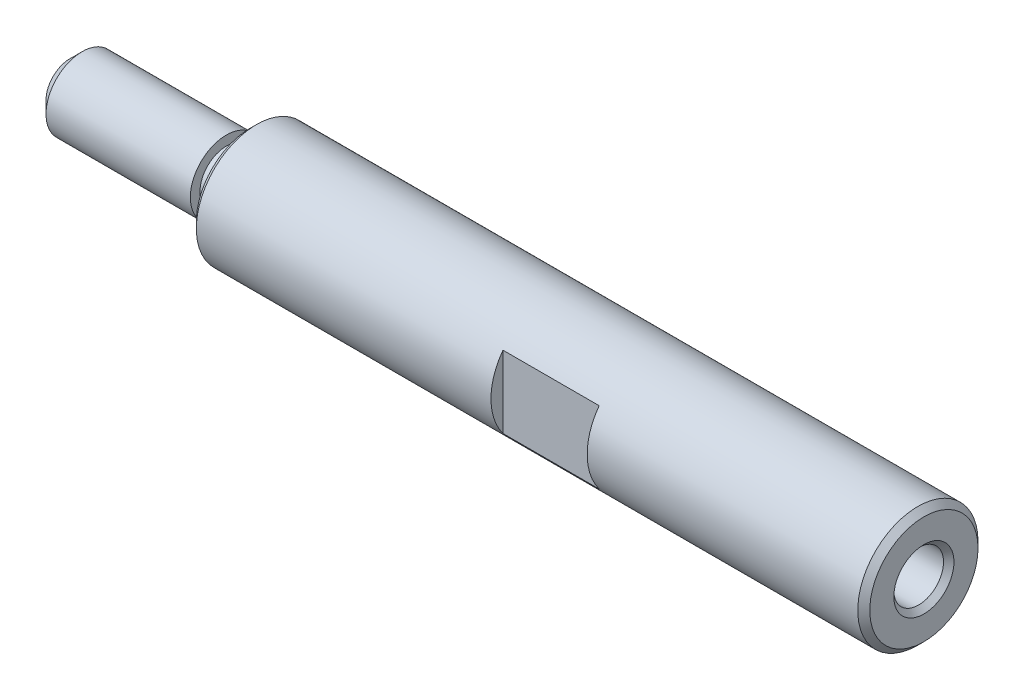
ISO-10303-21;
HEADER;
FILE_DESCRIPTION(('STEP AP214'),'2;1');
FILE_NAME('part.step','',(''),(''),'','','');
FILE_SCHEMA(('AUTOMOTIVE_DESIGN { 1 0 10303 214 1 1 1 1 }'));
ENDSEC;
DATA;
#1=APPLICATION_CONTEXT('core data for automotive mechanical design processes');
#2=APPLICATION_PROTOCOL_DEFINITION('international standard','automotive_design',2000,#1);
#3=PRODUCT_CONTEXT('',#1,'mechanical');
#4=PRODUCT('Part','Part','',(#3));
#5=PRODUCT_RELATED_PRODUCT_CATEGORY('part','',(#4));
#6=PRODUCT_DEFINITION_FORMATION('','',#4);
#7=PRODUCT_DEFINITION_CONTEXT('part definition',#1,'design');
#8=PRODUCT_DEFINITION('design','',#6,#7);
#9=PRODUCT_DEFINITION_SHAPE('','',#8);
#10=(LENGTH_UNIT() NAMED_UNIT(*) SI_UNIT(.MILLI.,.METRE.));
#11=(NAMED_UNIT(*) PLANE_ANGLE_UNIT() SI_UNIT($,.RADIAN.));
#12=(NAMED_UNIT(*) SI_UNIT($,.STERADIAN.) SOLID_ANGLE_UNIT());
#13=UNCERTAINTY_MEASURE_WITH_UNIT(LENGTH_MEASURE(1.E-05),#10,'distance_accuracy_value','');
#14=(GEOMETRIC_REPRESENTATION_CONTEXT(3) GLOBAL_UNCERTAINTY_ASSIGNED_CONTEXT((#13)) GLOBAL_UNIT_ASSIGNED_CONTEXT((#10,
#11,#12)) REPRESENTATION_CONTEXT('',''));
#15=CARTESIAN_POINT('',(0.,0.,0.));
#16=DIRECTION('',(0.,0.,1.));
#17=DIRECTION('',(1.,0.,0.));
#18=AXIS2_PLACEMENT_3D('',#15,#16,#17);
#19=CARTESIAN_POINT('',(-15.,0.,0.));
#20=DIRECTION('',(1.,0.,0.));
#21=DIRECTION('',(0.,0.,-1.));
#22=AXIS2_PLACEMENT_3D('',#19,#20,#21);
#23=PLANE('',#22);
#24=CARTESIAN_POINT('',(-15.,0.,0.));
#25=DIRECTION('',(1.,0.,0.));
#26=DIRECTION('',(0.,0.,-1.));
#27=AXIS2_PLACEMENT_3D('',#24,#25,#26);
#28=CIRCLE('',#27,2.);
#29=CARTESIAN_POINT('',(-15.,0.,-2.));
#30=VERTEX_POINT('',#29);
#31=EDGE_CURVE('E82',#30,#30,#28,.T.);
#32=ORIENTED_EDGE('',*,*,#31,.F.);
#33=EDGE_LOOP('',(#32));
#34=FACE_BOUND('',#33,.T.);
#35=ADVANCED_FACE('F16',(#34),#23,.F.);
#36=CARTESIAN_POINT('',(-15.,0.,0.));
#37=DIRECTION('',(1.,0.,0.));
#38=DIRECTION('',(0.,0.,-1.));
#39=AXIS2_PLACEMENT_3D('',#36,#37,#38);
#40=CONICAL_SURFACE('',#39,2.,0.785398163397448);
#41=CARTESIAN_POINT('',(-14.,0.,0.));
#42=DIRECTION('',(1.,0.,0.));
#43=DIRECTION('',(0.,0.,-1.));
#44=AXIS2_PLACEMENT_3D('',#41,#42,#43);
#45=CIRCLE('',#44,3.);
#46=CARTESIAN_POINT('',(-14.,0.,-3.));
#47=VERTEX_POINT('',#46);
#48=EDGE_CURVE('E85',#47,#47,#45,.T.);
#49=ORIENTED_EDGE('',*,*,#48,.F.);
#50=EDGE_LOOP('',(#49));
#51=FACE_BOUND('',#50,.T.);
#52=ORIENTED_EDGE('',*,*,#31,.T.);
#53=EDGE_LOOP('',(#52));
#54=FACE_BOUND('',#53,.T.);
#55=ADVANCED_FACE('F141',(#51,#54),#40,.T.);
#56=CARTESIAN_POINT('',(56.,0.,0.));
#57=DIRECTION('',(1.,0.,0.));
#58=DIRECTION('',(0.,0.,-1.));
#59=AXIS2_PLACEMENT_3D('',#56,#57,#58);
#60=CYLINDRICAL_SURFACE('',#59,3.);
#61=CARTESIAN_POINT('',(-2.,0.,0.));
#62=DIRECTION('',(1.,0.,0.));
#63=DIRECTION('',(0.,0.,-1.));
#64=AXIS2_PLACEMENT_3D('',#61,#62,#63);
#65=CIRCLE('',#64,3.);
#66=CARTESIAN_POINT('',(-2.,0.,-3.));
#67=VERTEX_POINT('',#66);
#68=EDGE_CURVE('E88',#67,#67,#65,.T.);
#69=ORIENTED_EDGE('',*,*,#68,.F.);
#70=EDGE_LOOP('',(#69));
#71=FACE_BOUND('',#70,.T.);
#72=ORIENTED_EDGE('',*,*,#48,.T.);
#73=EDGE_LOOP('',(#72));
#74=FACE_BOUND('',#73,.T.);
#75=ADVANCED_FACE('F146',(#71,#74),#60,.T.);
#76=CARTESIAN_POINT('',(-2.,3.,0.));
#77=DIRECTION('',(-1.,0.,0.));
#78=DIRECTION('',(0.,0.,1.));
#79=AXIS2_PLACEMENT_3D('',#76,#77,#78);
#80=PLANE('',#79);
#81=CARTESIAN_POINT('',(-2.,0.,0.));
#82=DIRECTION('',(1.,0.,0.));
#83=DIRECTION('',(0.,0.,-1.));
#84=AXIS2_PLACEMENT_3D('',#81,#82,#83);
#85=CIRCLE('',#84,2.2);
#86=CARTESIAN_POINT('',(-2.,0.,-2.2));
#87=VERTEX_POINT('',#86);
#88=EDGE_CURVE('E91',#87,#87,#85,.T.);
#89=ORIENTED_EDGE('',*,*,#88,.F.);
#90=EDGE_LOOP('',(#89));
#91=FACE_BOUND('',#90,.T.);
#92=ORIENTED_EDGE('',*,*,#68,.T.);
#93=EDGE_LOOP('',(#92));
#94=FACE_BOUND('',#93,.T.);
#95=ADVANCED_FACE('F153',(#91,#94),#80,.F.);
#96=CARTESIAN_POINT('',(56.,0.,0.));
#97=DIRECTION('',(1.,0.,0.));
#98=DIRECTION('',(0.,0.,-1.));
#99=AXIS2_PLACEMENT_3D('',#96,#97,#98);
#100=CYLINDRICAL_SURFACE('',#99,2.2);
#101=CARTESIAN_POINT('',(0.,0.,0.));
#102=DIRECTION('',(1.,0.,0.));
#103=DIRECTION('',(0.,0.,-1.));
#104=AXIS2_PLACEMENT_3D('',#101,#102,#103);
#105=CIRCLE('',#104,2.2);
#106=CARTESIAN_POINT('',(0.,0.,-2.2));
#107=VERTEX_POINT('',#106);
#108=EDGE_CURVE('E94',#107,#107,#105,.T.);
#109=ORIENTED_EDGE('',*,*,#108,.F.);
#110=EDGE_LOOP('',(#109));
#111=FACE_BOUND('',#110,.T.);
#112=ORIENTED_EDGE('',*,*,#88,.T.);
#113=EDGE_LOOP('',(#112));
#114=FACE_BOUND('',#113,.T.);
#115=ADVANCED_FACE('F160',(#111,#114),#100,.T.);
#116=CARTESIAN_POINT('',(0.,2.2,0.));
#117=DIRECTION('',(1.,0.,0.));
#118=DIRECTION('',(0.,0.,-1.));
#119=AXIS2_PLACEMENT_3D('',#116,#117,#118);
#120=PLANE('',#119);
#121=CARTESIAN_POINT('',(0.,0.,0.));
#122=DIRECTION('',(1.,0.,0.));
#123=DIRECTION('',(0.,0.,-1.));
#124=AXIS2_PLACEMENT_3D('',#121,#122,#123);
#125=CIRCLE('',#124,4.5);
#126=CARTESIAN_POINT('',(0.,0.,-4.5));
#127=VERTEX_POINT('',#126);
#128=EDGE_CURVE('E97',#127,#127,#125,.T.);
#129=ORIENTED_EDGE('',*,*,#128,.F.);
#130=EDGE_LOOP('',(#129));
#131=FACE_BOUND('',#130,.T.);
#132=ORIENTED_EDGE('',*,*,#108,.T.);
#133=EDGE_LOOP('',(#132));
#134=FACE_BOUND('',#133,.T.);
#135=ADVANCED_FACE('F164',(#131,#134),#120,.F.);
#136=CARTESIAN_POINT('',(0.,0.,0.));
#137=DIRECTION('',(1.,0.,0.));
#138=DIRECTION('',(0.,0.,-1.));
#139=AXIS2_PLACEMENT_3D('',#136,#137,#138);
#140=CONICAL_SURFACE('',#139,4.5,0.785398163397447);
#141=CARTESIAN_POINT('',(0.500000000000007,0.,0.));
#142=DIRECTION('',(1.,0.,0.));
#143=DIRECTION('',(0.,0.,-1.));
#144=AXIS2_PLACEMENT_3D('',#141,#142,#143);
#145=CIRCLE('',#144,5.);
#146=CARTESIAN_POINT('',(0.500000000000007,0.,-5.));
#147=VERTEX_POINT('',#146);
#148=EDGE_CURVE('E100',#147,#147,#145,.T.);
#149=ORIENTED_EDGE('',*,*,#148,.F.);
#150=EDGE_LOOP('',(#149));
#151=FACE_BOUND('',#150,.T.);
#152=ORIENTED_EDGE('',*,*,#128,.T.);
#153=EDGE_LOOP('',(#152));
#154=FACE_BOUND('',#153,.T.);
#155=ADVANCED_FACE('F168',(#151,#154),#140,.T.);
#156=CARTESIAN_POINT('',(56.,0.,0.));
#157=DIRECTION('',(1.,0.,0.));
#158=DIRECTION('',(0.,0.,-1.));
#159=AXIS2_PLACEMENT_3D('',#156,#157,#158);
#160=CYLINDRICAL_SURFACE('',#159,5.);
#161=CARTESIAN_POINT('',(55.5,0.,0.));
#162=DIRECTION('',(1.,0.,0.));
#163=DIRECTION('',(0.,0.,-1.));
#164=AXIS2_PLACEMENT_3D('',#161,#162,#163);
#165=CIRCLE('',#164,5.);
#166=CARTESIAN_POINT('',(55.5,0.,-5.));
#167=VERTEX_POINT('',#166);
#168=EDGE_CURVE('E103',#167,#167,#165,.T.);
#169=ORIENTED_EDGE('',*,*,#168,.F.);
#170=EDGE_LOOP('',(#169));
#171=FACE_BOUND('',#170,.T.);
#172=DIRECTION('',(1.,0.,0.));
#173=VECTOR('',#172,1.);
#174=CARTESIAN_POINT('',(56.,3.,4.));
#175=LINE('',#174,#173);
#176=CARTESIAN_POINT('',(25.,3.,4.));
#177=VERTEX_POINT('',#176);
#178=CARTESIAN_POINT('',(33.,3.,4.));
#179=VERTEX_POINT('',#178);
#180=EDGE_CURVE('E19',#177,#179,#175,.T.);
#181=ORIENTED_EDGE('',*,*,#180,.T.);
#182=CARTESIAN_POINT('',(33.,0.,0.));
#183=DIRECTION('',(1.,0.,0.));
#184=DIRECTION('',(0.,0.,-1.));
#185=AXIS2_PLACEMENT_3D('',#182,#183,#184);
#186=CIRCLE('',#185,5.);
#187=CARTESIAN_POINT('',(33.,-3.,4.));
#188=VERTEX_POINT('',#187);
#189=EDGE_CURVE('E11',#179,#188,#186,.T.);
#190=ORIENTED_EDGE('',*,*,#189,.T.);
#191=DIRECTION('',(1.,0.,0.));
#192=VECTOR('',#191,1.);
#193=CARTESIAN_POINT('',(56.,-3.,4.));
#194=LINE('',#193,#192);
#195=CARTESIAN_POINT('',(25.,-3.,4.));
#196=VERTEX_POINT('',#195);
#197=EDGE_CURVE('E64',#188,#196,#194,.F.);
#198=ORIENTED_EDGE('',*,*,#197,.T.);
#199=CARTESIAN_POINT('',(25.,0.,0.));
#200=DIRECTION('',(1.,0.,0.));
#201=DIRECTION('',(0.,0.,-1.));
#202=AXIS2_PLACEMENT_3D('',#199,#200,#201);
#203=CIRCLE('',#202,5.);
#204=EDGE_CURVE('E59',#177,#196,#203,.T.);
#205=ORIENTED_EDGE('',*,*,#204,.F.);
#206=EDGE_LOOP('',(#181,#190,#198,#205));
#207=FACE_BOUND('',#206,.T.);
#208=DIRECTION('',(1.,0.,0.));
#209=VECTOR('',#208,1.);
#210=CARTESIAN_POINT('',(56.,-3.,-4.));
#211=LINE('',#210,#209);
#212=CARTESIAN_POINT('',(25.,-3.,-4.));
#213=VERTEX_POINT('',#212);
#214=CARTESIAN_POINT('',(33.,-3.,-4.));
#215=VERTEX_POINT('',#214);
#216=EDGE_CURVE('E76',#213,#215,#211,.T.);
#217=ORIENTED_EDGE('',*,*,#216,.T.);
#218=CARTESIAN_POINT('',(33.,3.,-4.));
#219=VERTEX_POINT('',#218);
#220=EDGE_CURVE('E25',#215,#219,#186,.T.);
#221=ORIENTED_EDGE('',*,*,#220,.T.);
#222=DIRECTION('',(1.,0.,0.));
#223=VECTOR('',#222,1.);
#224=CARTESIAN_POINT('',(56.,3.,-4.));
#225=LINE('',#224,#223);
#226=CARTESIAN_POINT('',(25.,3.,-4.));
#227=VERTEX_POINT('',#226);
#228=EDGE_CURVE('E79',#219,#227,#225,.F.);
#229=ORIENTED_EDGE('',*,*,#228,.T.);
#230=EDGE_CURVE('E66',#213,#227,#203,.T.);
#231=ORIENTED_EDGE('',*,*,#230,.F.);
#232=EDGE_LOOP('',(#217,#221,#229,#231));
#233=FACE_BOUND('',#232,.T.);
#234=ORIENTED_EDGE('',*,*,#148,.T.);
#235=EDGE_LOOP('',(#234));
#236=FACE_BOUND('',#235,.T.);
#237=ADVANCED_FACE('F72',(#171,#207,#233,#236),#160,.T.);
#238=CARTESIAN_POINT('',(55.5,0.,0.));
#239=DIRECTION('',(-1.,0.,0.));
#240=DIRECTION('',(0.,0.,1.));
#241=AXIS2_PLACEMENT_3D('',#238,#239,#240);
#242=CONICAL_SURFACE('',#241,5.,0.785398163397447);
#243=CARTESIAN_POINT('',(56.,0.,0.));
#244=DIRECTION('',(1.,0.,0.));
#245=DIRECTION('',(0.,0.,-1.));
#246=AXIS2_PLACEMENT_3D('',#243,#244,#245);
#247=CIRCLE('',#246,4.5);
#248=CARTESIAN_POINT('',(56.,0.,-4.5));
#249=VERTEX_POINT('',#248);
#250=EDGE_CURVE('E106',#249,#249,#247,.T.);
#251=ORIENTED_EDGE('',*,*,#250,.F.);
#252=EDGE_LOOP('',(#251));
#253=FACE_BOUND('',#252,.T.);
#254=ORIENTED_EDGE('',*,*,#168,.T.);
#255=EDGE_LOOP('',(#254));
#256=FACE_BOUND('',#255,.T.);
#257=ADVANCED_FACE('F175',(#253,#256),#242,.T.);
#258=CARTESIAN_POINT('',(56.,4.5,0.));
#259=DIRECTION('',(-1.,0.,0.));
#260=DIRECTION('',(0.,0.,1.));
#261=AXIS2_PLACEMENT_3D('',#258,#259,#260);
#262=PLANE('',#261);
#263=CARTESIAN_POINT('',(56.,0.,0.));
#264=DIRECTION('',(1.,0.,0.));
#265=DIRECTION('',(0.,0.,-1.));
#266=AXIS2_PLACEMENT_3D('',#263,#264,#265);
#267=CIRCLE('',#266,2.5);
#268=CARTESIAN_POINT('',(56.,0.,-2.5));
#269=VERTEX_POINT('',#268);
#270=EDGE_CURVE('E115',#269,#269,#267,.T.);
#271=ORIENTED_EDGE('',*,*,#270,.F.);
#272=EDGE_LOOP('',(#271));
#273=FACE_BOUND('',#272,.T.);
#274=ORIENTED_EDGE('',*,*,#250,.T.);
#275=EDGE_LOOP('',(#274));
#276=FACE_BOUND('',#275,.T.);
#277=ADVANCED_FACE('F179',(#273,#276),#262,.F.);
#278=CARTESIAN_POINT('',(39.5,0.,0.));
#279=DIRECTION('',(1.,0.,0.));
#280=DIRECTION('',(0.,0.,-1.));
#281=AXIS2_PLACEMENT_3D('',#278,#279,#280);
#282=CONICAL_SURFACE('',#281,0.,1.04719755119659);
#283=CARTESIAN_POINT('',(40.693383006415,0.,0.));
#284=DIRECTION('',(1.,0.,0.));
#285=DIRECTION('',(0.,0.,-1.));
#286=AXIS2_PLACEMENT_3D('',#283,#284,#285);
#287=CIRCLE('',#286,2.067);
#288=CARTESIAN_POINT('',(40.693383006415,0.,-2.067));
#289=VERTEX_POINT('',#288);
#290=EDGE_CURVE('E109',#289,#289,#287,.T.);
#291=ORIENTED_EDGE('',*,*,#290,.T.);
#292=EDGE_LOOP('',(#291));
#293=FACE_BOUND('',#292,.T.);
#294=CARTESIAN_POINT('',(39.5,0.,0.));
#295=VERTEX_POINT('',#294);
#296=VERTEX_LOOP('',#295);
#297=FACE_BOUND('',#296,.T.);
#298=ADVANCED_FACE('F183',(#293,#297),#282,.F.);
#299=CARTESIAN_POINT('',(56.,0.,0.));
#300=DIRECTION('',(1.,0.,0.));
#301=DIRECTION('',(0.,0.,-1.));
#302=AXIS2_PLACEMENT_3D('',#299,#300,#301);
#303=CYLINDRICAL_SURFACE('',#302,2.067);
#304=CARTESIAN_POINT('',(55.567,0.,0.));
#305=DIRECTION('',(1.,0.,0.));
#306=DIRECTION('',(0.,0.,-1.));
#307=AXIS2_PLACEMENT_3D('',#304,#305,#306);
#308=CIRCLE('',#307,2.067);
#309=CARTESIAN_POINT('',(55.567,0.,-2.067));
#310=VERTEX_POINT('',#309);
#311=EDGE_CURVE('E112',#310,#310,#308,.T.);
#312=ORIENTED_EDGE('',*,*,#311,.T.);
#313=EDGE_LOOP('',(#312));
#314=FACE_BOUND('',#313,.T.);
#315=ORIENTED_EDGE('',*,*,#290,.F.);
#316=EDGE_LOOP('',(#315));
#317=FACE_BOUND('',#316,.T.);
#318=ADVANCED_FACE('F187',(#314,#317),#303,.F.);
#319=CARTESIAN_POINT('',(55.567,0.,0.));
#320=DIRECTION('',(1.,0.,0.));
#321=DIRECTION('',(0.,0.,-1.));
#322=AXIS2_PLACEMENT_3D('',#319,#320,#321);
#323=CONICAL_SURFACE('',#322,2.067,0.785398163397445);
#324=ORIENTED_EDGE('',*,*,#270,.T.);
#325=EDGE_LOOP('',(#324));
#326=FACE_BOUND('',#325,.T.);
#327=ORIENTED_EDGE('',*,*,#311,.F.);
#328=EDGE_LOOP('',(#327));
#329=FACE_BOUND('',#328,.T.);
#330=ADVANCED_FACE('F138',(#326,#329),#323,.F.);
#331=CARTESIAN_POINT('',(33.,0.,0.));
#332=DIRECTION('',(1.,0.,0.));
#333=DIRECTION('',(0.,0.,-1.));
#334=AXIS2_PLACEMENT_3D('',#331,#332,#333);
#335=PLANE('',#334);
#336=DIRECTION('',(0.,1.,0.));
#337=VECTOR('',#336,1.);
#338=CARTESIAN_POINT('',(33.,-20.,-4.));
#339=LINE('',#338,#337);
#340=EDGE_CURVE('E118',#215,#219,#339,.T.);
#341=ORIENTED_EDGE('',*,*,#340,.T.);
#342=ORIENTED_EDGE('',*,*,#220,.F.);
#343=EDGE_LOOP('',(#341,#342));
#344=FACE_BOUND('',#343,.T.);
#345=ADVANCED_FACE('F127',(#344),#335,.F.);
#346=CARTESIAN_POINT('',(25.,0.,0.));
#347=DIRECTION('',(1.,0.,0.));
#348=DIRECTION('',(0.,0.,-1.));
#349=AXIS2_PLACEMENT_3D('',#346,#347,#348);
#350=PLANE('',#349);
#351=ORIENTED_EDGE('',*,*,#230,.T.);
#352=DIRECTION('',(0.,1.,0.));
#353=VECTOR('',#352,1.);
#354=CARTESIAN_POINT('',(25.,-20.,-4.));
#355=LINE('',#354,#353);
#356=EDGE_CURVE('E38',#213,#227,#355,.T.);
#357=ORIENTED_EDGE('',*,*,#356,.F.);
#358=EDGE_LOOP('',(#351,#357));
#359=FACE_BOUND('',#358,.T.);
#360=ADVANCED_FACE('F134',(#359),#350,.T.);
#361=CARTESIAN_POINT('',(33.,-20.,-4.));
#362=DIRECTION('',(0.,0.,1.));
#363=DIRECTION('',(1.,0.,0.));
#364=AXIS2_PLACEMENT_3D('',#361,#362,#363);
#365=PLANE('',#364);
#366=ORIENTED_EDGE('',*,*,#356,.T.);
#367=ORIENTED_EDGE('',*,*,#228,.F.);
#368=ORIENTED_EDGE('',*,*,#340,.F.);
#369=ORIENTED_EDGE('',*,*,#216,.F.);
#370=EDGE_LOOP('',(#366,#367,#368,#369));
#371=FACE_BOUND('',#370,.T.);
#372=ADVANCED_FACE('F135',(#371),#365,.F.);
#373=CARTESIAN_POINT('',(33.,20.,4.));
#374=DIRECTION('',(0.,0.,-1.));
#375=DIRECTION('',(-1.,0.,0.));
#376=AXIS2_PLACEMENT_3D('',#373,#374,#375);
#377=PLANE('',#376);
#378=DIRECTION('',(0.,-1.,0.));
#379=VECTOR('',#378,1.);
#380=CARTESIAN_POINT('',(25.,20.,4.));
#381=LINE('',#380,#379);
#382=EDGE_CURVE('E31',#177,#196,#381,.T.);
#383=ORIENTED_EDGE('',*,*,#382,.T.);
#384=ORIENTED_EDGE('',*,*,#197,.F.);
#385=DIRECTION('',(0.,-1.,0.));
#386=VECTOR('',#385,1.);
#387=CARTESIAN_POINT('',(33.,20.,4.));
#388=LINE('',#387,#386);
#389=EDGE_CURVE('E119',#179,#188,#388,.T.);
#390=ORIENTED_EDGE('',*,*,#389,.F.);
#391=ORIENTED_EDGE('',*,*,#180,.F.);
#392=EDGE_LOOP('',(#383,#384,#390,#391));
#393=FACE_BOUND('',#392,.T.);
#394=ADVANCED_FACE('F68',(#393),#377,.F.);
#395=ORIENTED_EDGE('',*,*,#389,.T.);
#396=ORIENTED_EDGE('',*,*,#189,.F.);
#397=EDGE_LOOP('',(#395,#396));
#398=FACE_BOUND('',#397,.T.);
#399=ADVANCED_FACE('F124',(#398),#335,.F.);
#400=ORIENTED_EDGE('',*,*,#204,.T.);
#401=ORIENTED_EDGE('',*,*,#382,.F.);
#402=EDGE_LOOP('',(#400,#401));
#403=FACE_BOUND('',#402,.T.);
#404=ADVANCED_FACE('F60',(#403),#350,.T.);
#405=CLOSED_SHELL('',(#35,#55,#75,#95,#115,#135,#155,#237,#257,#277,#298,#318,#330,#345,#360,
#372,#394,#399,#404));
#406=MANIFOLD_SOLID_BREP('B1',#405);
#407=ADVANCED_BREP_SHAPE_REPRESENTATION('',(#18,#406),#14);
#408=SHAPE_DEFINITION_REPRESENTATION(#9,#407);
ENDSEC;
END-ISO-10303-21;
